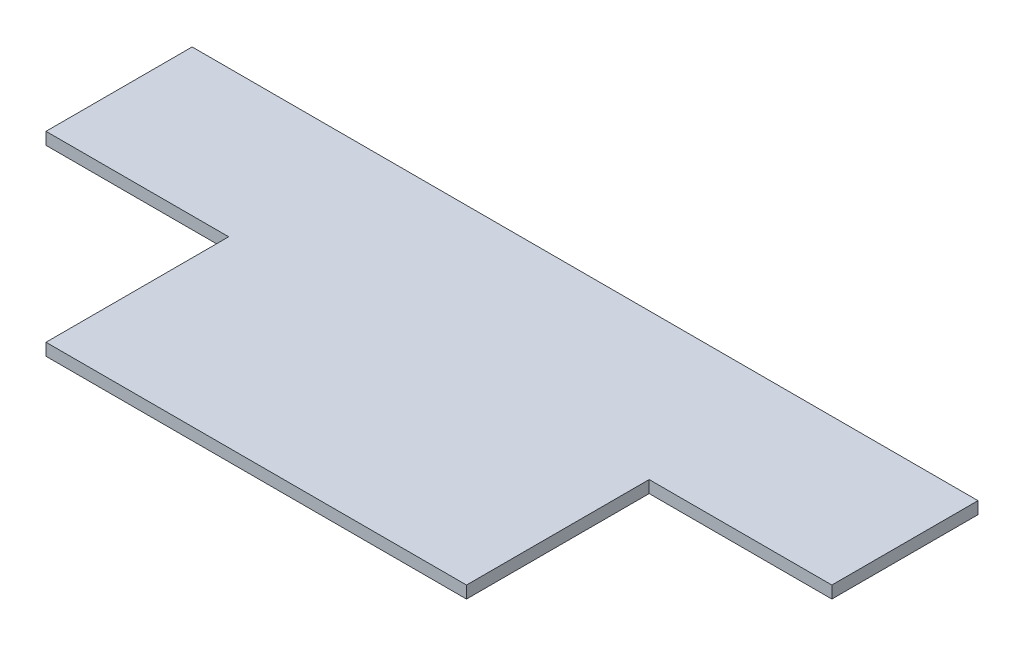
ISO-10303-21;
HEADER;
FILE_DESCRIPTION(('STEP AP214'),'2;1');
FILE_NAME('part.step','',(''),(''),'','','');
FILE_SCHEMA(('AUTOMOTIVE_DESIGN { 1 0 10303 214 1 1 1 1 }'));
ENDSEC;
DATA;
#1=APPLICATION_CONTEXT('core data for automotive mechanical design processes');
#2=APPLICATION_PROTOCOL_DEFINITION('international standard','automotive_design',2000,#1);
#3=PRODUCT_CONTEXT('',#1,'mechanical');
#4=PRODUCT('Part','Part','',(#3));
#5=PRODUCT_RELATED_PRODUCT_CATEGORY('part','',(#4));
#6=PRODUCT_DEFINITION_FORMATION('','',#4);
#7=PRODUCT_DEFINITION_CONTEXT('part definition',#1,'design');
#8=PRODUCT_DEFINITION('design','',#6,#7);
#9=PRODUCT_DEFINITION_SHAPE('','',#8);
#10=(LENGTH_UNIT() NAMED_UNIT(*) SI_UNIT(.MILLI.,.METRE.));
#11=(NAMED_UNIT(*) PLANE_ANGLE_UNIT() SI_UNIT($,.RADIAN.));
#12=(NAMED_UNIT(*) SI_UNIT($,.STERADIAN.) SOLID_ANGLE_UNIT());
#13=UNCERTAINTY_MEASURE_WITH_UNIT(LENGTH_MEASURE(1.E-05),#10,'distance_accuracy_value','');
#14=(GEOMETRIC_REPRESENTATION_CONTEXT(3) GLOBAL_UNCERTAINTY_ASSIGNED_CONTEXT((#13)) GLOBAL_UNIT_ASSIGNED_CONTEXT((#10,
#11,#12)) REPRESENTATION_CONTEXT('',''));
#15=CARTESIAN_POINT('',(0.,0.,0.));
#16=DIRECTION('',(0.,0.,1.));
#17=DIRECTION('',(1.,0.,0.));
#18=AXIS2_PLACEMENT_3D('',#15,#16,#17);
#19=CARTESIAN_POINT('',(0.,-1.5875,19.05));
#20=DIRECTION('',(-1.,0.,0.));
#21=DIRECTION('',(0.,0.,1.));
#22=AXIS2_PLACEMENT_3D('',#19,#20,#21);
#23=PLANE('',#22);
#24=DIRECTION('',(0.,0.,1.));
#25=VECTOR('',#24,1.);
#26=CARTESIAN_POINT('',(0.,0.,19.05));
#27=LINE('',#26,#25);
#28=CARTESIAN_POINT('',(0.,0.,0.));
#29=VERTEX_POINT('',#28);
#30=CARTESIAN_POINT('',(0.,0.,19.05));
#31=VERTEX_POINT('',#30);
#32=EDGE_CURVE('E140',#29,#31,#27,.T.);
#33=ORIENTED_EDGE('',*,*,#32,.F.);
#34=DIRECTION('',(0.,1.,0.));
#35=VECTOR('',#34,1.);
#36=CARTESIAN_POINT('',(0.,-1.5875,0.));
#37=LINE('',#36,#35);
#38=CARTESIAN_POINT('',(0.,-1.5875,0.));
#39=VERTEX_POINT('',#38);
#40=EDGE_CURVE('E11',#39,#29,#37,.T.);
#41=ORIENTED_EDGE('',*,*,#40,.F.);
#42=DIRECTION('',(0.,0.,1.));
#43=VECTOR('',#42,1.);
#44=CARTESIAN_POINT('',(0.,-1.5875,19.05));
#45=LINE('',#44,#43);
#46=CARTESIAN_POINT('',(0.,-1.5875,19.05));
#47=VERTEX_POINT('',#46);
#48=EDGE_CURVE('E160',#39,#47,#45,.T.);
#49=ORIENTED_EDGE('',*,*,#48,.T.);
#50=DIRECTION('',(0.,1.,0.));
#51=VECTOR('',#50,1.);
#52=CARTESIAN_POINT('',(0.,-1.5875,19.05));
#53=LINE('',#52,#51);
#54=EDGE_CURVE('E46',#47,#31,#53,.T.);
#55=ORIENTED_EDGE('',*,*,#54,.T.);
#56=EDGE_LOOP('',(#33,#41,#49,#55));
#57=FACE_BOUND('',#56,.T.);
#58=ADVANCED_FACE('F43',(#57),#23,.T.);
#59=CARTESIAN_POINT('',(0.,-1.5875,0.));
#60=DIRECTION('',(0.,0.,-1.));
#61=DIRECTION('',(-1.,0.,0.));
#62=AXIS2_PLACEMENT_3D('',#59,#60,#61);
#63=PLANE('',#62);
#64=DIRECTION('',(-1.,0.,0.));
#65=VECTOR('',#64,1.);
#66=CARTESIAN_POINT('',(0.,0.,0.));
#67=LINE('',#66,#65);
#68=CARTESIAN_POINT('',(102.4382,0.,0.));
#69=VERTEX_POINT('',#68);
#70=EDGE_CURVE('E158',#69,#29,#67,.T.);
#71=ORIENTED_EDGE('',*,*,#70,.F.);
#72=DIRECTION('',(0.,1.,0.));
#73=VECTOR('',#72,1.);
#74=CARTESIAN_POINT('',(102.4382,-1.5875,0.));
#75=LINE('',#74,#73);
#76=CARTESIAN_POINT('',(102.4382,-1.5875,0.));
#77=VERTEX_POINT('',#76);
#78=EDGE_CURVE('E52',#77,#69,#75,.T.);
#79=ORIENTED_EDGE('',*,*,#78,.F.);
#80=DIRECTION('',(-1.,0.,0.));
#81=VECTOR('',#80,1.);
#82=CARTESIAN_POINT('',(0.,-1.5875,0.));
#83=LINE('',#82,#81);
#84=EDGE_CURVE('E130',#77,#39,#83,.T.);
#85=ORIENTED_EDGE('',*,*,#84,.T.);
#86=ORIENTED_EDGE('',*,*,#40,.T.);
#87=EDGE_LOOP('',(#71,#79,#85,#86));
#88=FACE_BOUND('',#87,.T.);
#89=ADVANCED_FACE('F172',(#88),#63,.T.);
#90=CARTESIAN_POINT('',(102.4382,-1.5875,0.));
#91=DIRECTION('',(1.,0.,0.));
#92=DIRECTION('',(0.,0.,-1.));
#93=AXIS2_PLACEMENT_3D('',#90,#91,#92);
#94=PLANE('',#93);
#95=DIRECTION('',(0.,0.,-1.));
#96=VECTOR('',#95,1.);
#97=CARTESIAN_POINT('',(102.4382,0.,0.));
#98=LINE('',#97,#96);
#99=CARTESIAN_POINT('',(102.4382,0.,19.05));
#100=VERTEX_POINT('',#99);
#101=EDGE_CURVE('E117',#100,#69,#98,.T.);
#102=ORIENTED_EDGE('',*,*,#101,.F.);
#103=DIRECTION('',(0.,1.,0.));
#104=VECTOR('',#103,1.);
#105=CARTESIAN_POINT('',(102.4382,-1.5875,19.05));
#106=LINE('',#105,#104);
#107=CARTESIAN_POINT('',(102.4382,-1.5875,19.05));
#108=VERTEX_POINT('',#107);
#109=EDGE_CURVE('E112',#108,#100,#106,.T.);
#110=ORIENTED_EDGE('',*,*,#109,.F.);
#111=DIRECTION('',(0.,0.,-1.));
#112=VECTOR('',#111,1.);
#113=CARTESIAN_POINT('',(102.4382,-1.5875,0.));
#114=LINE('',#113,#112);
#115=EDGE_CURVE('E115',#108,#77,#114,.T.);
#116=ORIENTED_EDGE('',*,*,#115,.T.);
#117=ORIENTED_EDGE('',*,*,#78,.T.);
#118=EDGE_LOOP('',(#102,#110,#116,#117));
#119=FACE_BOUND('',#118,.T.);
#120=ADVANCED_FACE('F114',(#119),#94,.T.);
#121=CARTESIAN_POINT('',(102.4382,-1.5875,19.05));
#122=DIRECTION('',(0.,0.,1.));
#123=DIRECTION('',(1.,0.,0.));
#124=AXIS2_PLACEMENT_3D('',#121,#122,#123);
#125=PLANE('',#124);
#126=DIRECTION('',(1.,0.,0.));
#127=VECTOR('',#126,1.);
#128=CARTESIAN_POINT('',(102.4382,0.,19.05));
#129=LINE('',#128,#127);
#130=CARTESIAN_POINT('',(78.6257,0.,19.05));
#131=VERTEX_POINT('',#130);
#132=EDGE_CURVE('E155',#131,#100,#129,.T.);
#133=ORIENTED_EDGE('',*,*,#132,.F.);
#134=DIRECTION('',(0.,1.,0.));
#135=VECTOR('',#134,1.);
#136=CARTESIAN_POINT('',(78.6257,-1.5875,19.05));
#137=LINE('',#136,#135);
#138=CARTESIAN_POINT('',(78.6257,-1.5875,19.05));
#139=VERTEX_POINT('',#138);
#140=EDGE_CURVE('E122',#139,#131,#137,.T.);
#141=ORIENTED_EDGE('',*,*,#140,.F.);
#142=DIRECTION('',(1.,0.,0.));
#143=VECTOR('',#142,1.);
#144=CARTESIAN_POINT('',(102.4382,-1.5875,19.05));
#145=LINE('',#144,#143);
#146=EDGE_CURVE('E128',#139,#108,#145,.T.);
#147=ORIENTED_EDGE('',*,*,#146,.T.);
#148=ORIENTED_EDGE('',*,*,#109,.T.);
#149=EDGE_LOOP('',(#133,#141,#147,#148));
#150=FACE_BOUND('',#149,.T.);
#151=ADVANCED_FACE('F132',(#150),#125,.T.);
#152=CARTESIAN_POINT('',(78.6257,-1.5875,19.05));
#153=DIRECTION('',(1.,0.,0.));
#154=DIRECTION('',(0.,0.,-1.));
#155=AXIS2_PLACEMENT_3D('',#152,#153,#154);
#156=PLANE('',#155);
#157=DIRECTION('',(0.,0.,-1.));
#158=VECTOR('',#157,1.);
#159=CARTESIAN_POINT('',(78.6257,0.,19.05));
#160=LINE('',#159,#158);
#161=CARTESIAN_POINT('',(78.6257,0.,42.8625));
#162=VERTEX_POINT('',#161);
#163=EDGE_CURVE('E152',#162,#131,#160,.T.);
#164=ORIENTED_EDGE('',*,*,#163,.F.);
#165=DIRECTION('',(0.,1.,0.));
#166=VECTOR('',#165,1.);
#167=CARTESIAN_POINT('',(78.6257,-1.5875,42.8625));
#168=LINE('',#167,#166);
#169=CARTESIAN_POINT('',(78.6257,-1.5875,42.8625));
#170=VERTEX_POINT('',#169);
#171=EDGE_CURVE('E164',#170,#162,#168,.T.);
#172=ORIENTED_EDGE('',*,*,#171,.F.);
#173=DIRECTION('',(0.,0.,-1.));
#174=VECTOR('',#173,1.);
#175=CARTESIAN_POINT('',(78.6257,-1.5875,19.05));
#176=LINE('',#175,#174);
#177=EDGE_CURVE('E133',#170,#139,#176,.T.);
#178=ORIENTED_EDGE('',*,*,#177,.T.);
#179=ORIENTED_EDGE('',*,*,#140,.T.);
#180=EDGE_LOOP('',(#164,#172,#178,#179));
#181=FACE_BOUND('',#180,.T.);
#182=ADVANCED_FACE('F185',(#181),#156,.T.);
#183=CARTESIAN_POINT('',(78.6257,-1.5875,42.8625));
#184=DIRECTION('',(0.,0.,1.));
#185=DIRECTION('',(1.,0.,0.));
#186=AXIS2_PLACEMENT_3D('',#183,#184,#185);
#187=PLANE('',#186);
#188=DIRECTION('',(1.,0.,0.));
#189=VECTOR('',#188,1.);
#190=CARTESIAN_POINT('',(78.6257,0.,42.8625));
#191=LINE('',#190,#189);
#192=CARTESIAN_POINT('',(23.8125,0.,42.8625));
#193=VERTEX_POINT('',#192);
#194=EDGE_CURVE('E149',#193,#162,#191,.T.);
#195=ORIENTED_EDGE('',*,*,#194,.F.);
#196=DIRECTION('',(0.,1.,0.));
#197=VECTOR('',#196,1.);
#198=CARTESIAN_POINT('',(23.8125,-1.5875,42.8625));
#199=LINE('',#198,#197);
#200=CARTESIAN_POINT('',(23.8125,-1.5875,42.8625));
#201=VERTEX_POINT('',#200);
#202=EDGE_CURVE('E166',#201,#193,#199,.T.);
#203=ORIENTED_EDGE('',*,*,#202,.F.);
#204=DIRECTION('',(1.,0.,0.));
#205=VECTOR('',#204,1.);
#206=CARTESIAN_POINT('',(78.6257,-1.5875,42.8625));
#207=LINE('',#206,#205);
#208=EDGE_CURVE('E135',#201,#170,#207,.T.);
#209=ORIENTED_EDGE('',*,*,#208,.T.);
#210=ORIENTED_EDGE('',*,*,#171,.T.);
#211=EDGE_LOOP('',(#195,#203,#209,#210));
#212=FACE_BOUND('',#211,.T.);
#213=ADVANCED_FACE('F188',(#212),#187,.T.);
#214=CARTESIAN_POINT('',(23.8125,-1.5875,42.8625));
#215=DIRECTION('',(-1.,0.,0.));
#216=DIRECTION('',(0.,0.,1.));
#217=AXIS2_PLACEMENT_3D('',#214,#215,#216);
#218=PLANE('',#217);
#219=DIRECTION('',(0.,0.,1.));
#220=VECTOR('',#219,1.);
#221=CARTESIAN_POINT('',(23.8125,0.,42.8625));
#222=LINE('',#221,#220);
#223=CARTESIAN_POINT('',(23.8125,0.,19.05));
#224=VERTEX_POINT('',#223);
#225=EDGE_CURVE('E146',#224,#193,#222,.T.);
#226=ORIENTED_EDGE('',*,*,#225,.F.);
#227=DIRECTION('',(0.,1.,0.));
#228=VECTOR('',#227,1.);
#229=CARTESIAN_POINT('',(23.8125,-1.5875,19.05));
#230=LINE('',#229,#228);
#231=CARTESIAN_POINT('',(23.8125,-1.5875,19.05));
#232=VERTEX_POINT('',#231);
#233=EDGE_CURVE('E167',#232,#224,#230,.T.);
#234=ORIENTED_EDGE('',*,*,#233,.F.);
#235=DIRECTION('',(0.,0.,1.));
#236=VECTOR('',#235,1.);
#237=CARTESIAN_POINT('',(23.8125,-1.5875,42.8625));
#238=LINE('',#237,#236);
#239=EDGE_CURVE('E303',#232,#201,#238,.T.);
#240=ORIENTED_EDGE('',*,*,#239,.T.);
#241=ORIENTED_EDGE('',*,*,#202,.T.);
#242=EDGE_LOOP('',(#226,#234,#240,#241));
#243=FACE_BOUND('',#242,.T.);
#244=ADVANCED_FACE('F192',(#243),#218,.T.);
#245=CARTESIAN_POINT('',(23.8125,-1.5875,19.05));
#246=DIRECTION('',(0.,0.,1.));
#247=DIRECTION('',(1.,0.,0.));
#248=AXIS2_PLACEMENT_3D('',#245,#246,#247);
#249=PLANE('',#248);
#250=DIRECTION('',(1.,0.,0.));
#251=VECTOR('',#250,1.);
#252=CARTESIAN_POINT('',(23.8125,0.,19.05));
#253=LINE('',#252,#251);
#254=EDGE_CURVE('E143',#31,#224,#253,.T.);
#255=ORIENTED_EDGE('',*,*,#254,.F.);
#256=ORIENTED_EDGE('',*,*,#54,.F.);
#257=DIRECTION('',(1.,0.,0.));
#258=VECTOR('',#257,1.);
#259=CARTESIAN_POINT('',(23.8125,-1.5875,19.05));
#260=LINE('',#259,#258);
#261=EDGE_CURVE('E304',#47,#232,#260,.T.);
#262=ORIENTED_EDGE('',*,*,#261,.T.);
#263=ORIENTED_EDGE('',*,*,#233,.T.);
#264=EDGE_LOOP('',(#255,#256,#262,#263));
#265=FACE_BOUND('',#264,.T.);
#266=ADVANCED_FACE('F169',(#265),#249,.T.);
#267=CARTESIAN_POINT('',(0.,-1.5875,0.));
#268=DIRECTION('',(0.,-1.,0.));
#269=DIRECTION('',(0.,0.,-1.));
#270=AXIS2_PLACEMENT_3D('',#267,#268,#269);
#271=PLANE('',#270);
#272=ORIENTED_EDGE('',*,*,#48,.F.);
#273=ORIENTED_EDGE('',*,*,#84,.F.);
#274=ORIENTED_EDGE('',*,*,#115,.F.);
#275=ORIENTED_EDGE('',*,*,#146,.F.);
#276=ORIENTED_EDGE('',*,*,#177,.F.);
#277=ORIENTED_EDGE('',*,*,#208,.F.);
#278=ORIENTED_EDGE('',*,*,#239,.F.);
#279=ORIENTED_EDGE('',*,*,#261,.F.);
#280=EDGE_LOOP('',(#272,#273,#274,#275,#276,#277,#278,#279));
#281=FACE_BOUND('',#280,.T.);
#282=ADVANCED_FACE('F126',(#281),#271,.T.);
#283=CARTESIAN_POINT('',(0.,0.,0.));
#284=DIRECTION('',(0.,-1.,0.));
#285=DIRECTION('',(0.,0.,-1.));
#286=AXIS2_PLACEMENT_3D('',#283,#284,#285);
#287=PLANE('',#286);
#288=ORIENTED_EDGE('',*,*,#32,.T.);
#289=ORIENTED_EDGE('',*,*,#254,.T.);
#290=ORIENTED_EDGE('',*,*,#225,.T.);
#291=ORIENTED_EDGE('',*,*,#194,.T.);
#292=ORIENTED_EDGE('',*,*,#163,.T.);
#293=ORIENTED_EDGE('',*,*,#132,.T.);
#294=ORIENTED_EDGE('',*,*,#101,.T.);
#295=ORIENTED_EDGE('',*,*,#70,.T.);
#296=EDGE_LOOP('',(#288,#289,#290,#291,#292,#293,#294,#295));
#297=FACE_BOUND('',#296,.T.);
#298=ADVANCED_FACE('F171',(#297),#287,.F.);
#299=CLOSED_SHELL('',(#58,#89,#120,#151,#182,#213,#244,#266,#282,#298));
#300=MANIFOLD_SOLID_BREP('B2',#299);
#301=ADVANCED_BREP_SHAPE_REPRESENTATION('',(#18,#300),#14);
#302=SHAPE_DEFINITION_REPRESENTATION(#9,#301);
ENDSEC;
END-ISO-10303-21;
